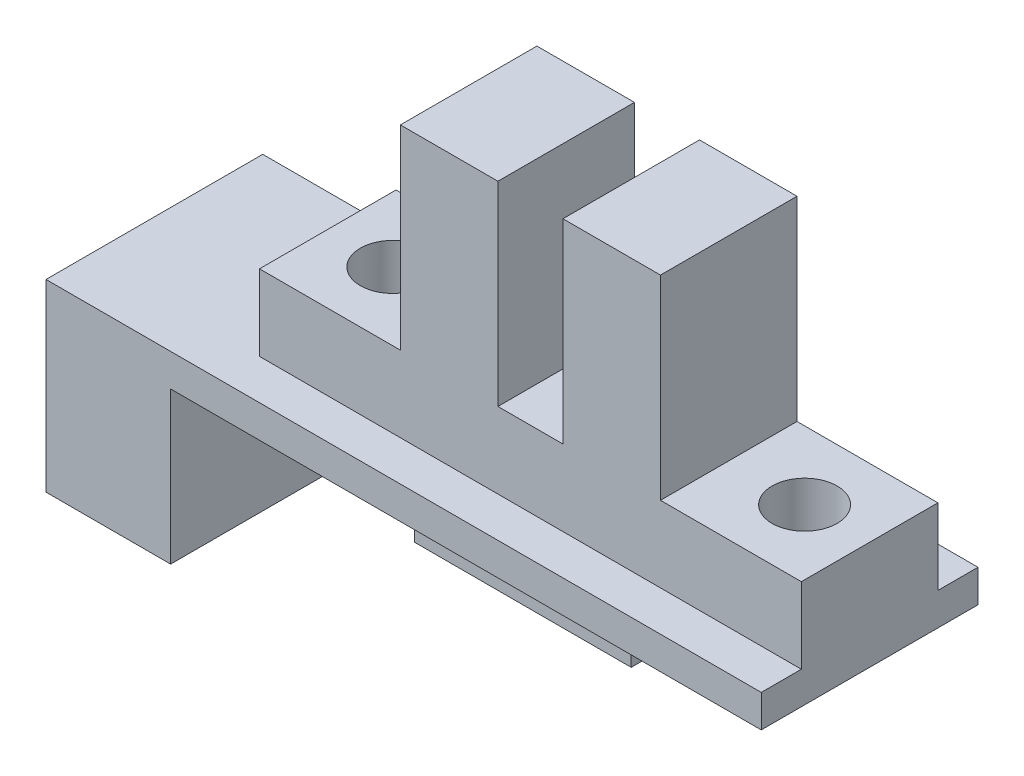
ISO-10303-21;
HEADER;
FILE_DESCRIPTION(('STEP AP214'),'2;1');
FILE_NAME('part.step','',(''),(''),'','','');
FILE_SCHEMA(('AUTOMOTIVE_DESIGN { 1 0 10303 214 1 1 1 1 }'));
ENDSEC;
DATA;
#1=APPLICATION_CONTEXT('core data for automotive mechanical design processes');
#2=APPLICATION_PROTOCOL_DEFINITION('international standard','automotive_design',2000,#1);
#3=PRODUCT_CONTEXT('',#1,'mechanical');
#4=PRODUCT('Part','Part','',(#3));
#5=PRODUCT_RELATED_PRODUCT_CATEGORY('part','',(#4));
#6=PRODUCT_DEFINITION_FORMATION('','',#4);
#7=PRODUCT_DEFINITION_CONTEXT('part definition',#1,'design');
#8=PRODUCT_DEFINITION('design','',#6,#7);
#9=PRODUCT_DEFINITION_SHAPE('','',#8);
#10=(LENGTH_UNIT() NAMED_UNIT(*) SI_UNIT(.MILLI.,.METRE.));
#11=(NAMED_UNIT(*) PLANE_ANGLE_UNIT() SI_UNIT($,.RADIAN.));
#12=(NAMED_UNIT(*) SI_UNIT($,.STERADIAN.) SOLID_ANGLE_UNIT());
#13=UNCERTAINTY_MEASURE_WITH_UNIT(LENGTH_MEASURE(1.E-05),#10,'distance_accuracy_value','');
#14=(GEOMETRIC_REPRESENTATION_CONTEXT(3) GLOBAL_UNCERTAINTY_ASSIGNED_CONTEXT((#13)) GLOBAL_UNIT_ASSIGNED_CONTEXT((#10,
#11,#12)) REPRESENTATION_CONTEXT('',''));
#15=CARTESIAN_POINT('',(0.,0.,0.));
#16=DIRECTION('',(0.,0.,1.));
#17=DIRECTION('',(1.,0.,0.));
#18=AXIS2_PLACEMENT_3D('',#15,#16,#17);
#19=CARTESIAN_POINT('',(0.,0.,0.));
#20=DIRECTION('',(0.,-1.,0.));
#21=DIRECTION('',(0.,0.,-1.));
#22=AXIS2_PLACEMENT_3D('',#19,#20,#21);
#23=PLANE('',#22);
#24=CARTESIAN_POINT('',(13.5,0.,0.));
#25=DIRECTION('',(0.,-1.,0.));
#26=DIRECTION('',(0.,0.,-1.));
#27=AXIS2_PLACEMENT_3D('',#24,#25,#26);
#28=CIRCLE('',#27,1.5);
#29=CARTESIAN_POINT('',(13.5,0.,-1.5));
#30=VERTEX_POINT('',#29);
#31=EDGE_CURVE('E39',#30,#30,#28,.T.);
#32=ORIENTED_EDGE('',*,*,#31,.F.);
#33=EDGE_LOOP('',(#32));
#34=FACE_BOUND('',#33,.T.);
#35=CARTESIAN_POINT('',(-5.49999999999999,0.,0.));
#36=DIRECTION('',(0.,-1.,0.));
#37=DIRECTION('',(0.,0.,-1.));
#38=AXIS2_PLACEMENT_3D('',#35,#36,#37);
#39=CIRCLE('',#38,1.5);
#40=CARTESIAN_POINT('',(-5.49999999999999,0.,-1.5));
#41=VERTEX_POINT('',#40);
#42=EDGE_CURVE('E306',#41,#41,#39,.T.);
#43=ORIENTED_EDGE('',*,*,#42,.F.);
#44=EDGE_LOOP('',(#43));
#45=FACE_BOUND('',#44,.T.);
#46=DIRECTION('',(0.,0.,1.));
#47=VECTOR('',#46,1.);
#48=CARTESIAN_POINT('',(-10.75,0.,5.));
#49=LINE('',#48,#47);
#50=CARTESIAN_POINT('',(-10.75,0.,-5.));
#51=VERTEX_POINT('',#50);
#52=CARTESIAN_POINT('',(-10.75,0.,5.));
#53=VERTEX_POINT('',#52);
#54=EDGE_CURVE('E311',#51,#53,#49,.T.);
#55=ORIENTED_EDGE('',*,*,#54,.F.);
#56=DIRECTION('',(-1.,0.,0.));
#57=VECTOR('',#56,1.);
#58=CARTESIAN_POINT('',(16.5,0.,-5.));
#59=LINE('',#58,#57);
#60=CARTESIAN_POINT('',(16.5,0.,-5.));
#61=VERTEX_POINT('',#60);
#62=EDGE_CURVE('E331',#61,#51,#59,.T.);
#63=ORIENTED_EDGE('',*,*,#62,.F.);
#64=DIRECTION('',(0.,0.,-1.));
#65=VECTOR('',#64,1.);
#66=CARTESIAN_POINT('',(16.5,0.,-5.));
#67=LINE('',#66,#65);
#68=CARTESIAN_POINT('',(16.5,0.,5.));
#69=VERTEX_POINT('',#68);
#70=EDGE_CURVE('E340',#69,#61,#67,.T.);
#71=ORIENTED_EDGE('',*,*,#70,.F.);
#72=DIRECTION('',(1.,0.,0.));
#73=VECTOR('',#72,1.);
#74=CARTESIAN_POINT('',(16.5,0.,5.));
#75=LINE('',#74,#73);
#76=EDGE_CURVE('E326',#53,#69,#75,.T.);
#77=ORIENTED_EDGE('',*,*,#76,.F.);
#78=EDGE_LOOP('',(#55,#63,#71,#77));
#79=FACE_BOUND('',#78,.T.);
#80=DIRECTION('',(1.,0.,0.));
#81=VECTOR('',#80,1.);
#82=CARTESIAN_POINT('',(9.00000000000001,0.,-3.5));
#83=LINE('',#82,#81);
#84=CARTESIAN_POINT('',(-0.999999999999986,0.,-3.5));
#85=VERTEX_POINT('',#84);
#86=CARTESIAN_POINT('',(9.00000000000001,0.,-3.5));
#87=VERTEX_POINT('',#86);
#88=EDGE_CURVE('E366',#85,#87,#83,.T.);
#89=ORIENTED_EDGE('',*,*,#88,.F.);
#90=DIRECTION('',(0.,0.,-1.));
#91=VECTOR('',#90,1.);
#92=CARTESIAN_POINT('',(-0.999999999999987,0.,3.5));
#93=LINE('',#92,#91);
#94=CARTESIAN_POINT('',(-0.999999999999987,0.,3.5));
#95=VERTEX_POINT('',#94);
#96=EDGE_CURVE('E208',#95,#85,#93,.T.);
#97=ORIENTED_EDGE('',*,*,#96,.F.);
#98=DIRECTION('',(-1.,0.,0.));
#99=VECTOR('',#98,1.);
#100=CARTESIAN_POINT('',(9.00000000000001,0.,3.5));
#101=LINE('',#100,#99);
#102=CARTESIAN_POINT('',(9.00000000000001,0.,3.5));
#103=VERTEX_POINT('',#102);
#104=EDGE_CURVE('E204',#103,#95,#101,.T.);
#105=ORIENTED_EDGE('',*,*,#104,.F.);
#106=DIRECTION('',(0.,0.,1.));
#107=VECTOR('',#106,1.);
#108=CARTESIAN_POINT('',(9.00000000000001,0.,3.5));
#109=LINE('',#108,#107);
#110=EDGE_CURVE('E368',#87,#103,#109,.T.);
#111=ORIENTED_EDGE('',*,*,#110,.F.);
#112=EDGE_LOOP('',(#89,#97,#105,#111));
#113=FACE_BOUND('',#112,.T.);
#114=ADVANCED_FACE('F35',(#34,#45,#79,#113),#23,.T.);
#115=CARTESIAN_POINT('',(0.,5.,0.));
#116=DIRECTION('',(0.,-1.,0.));
#117=DIRECTION('',(0.,0.,-1.));
#118=AXIS2_PLACEMENT_3D('',#115,#116,#117);
#119=PLANE('',#118);
#120=CARTESIAN_POINT('',(13.5,5.,0.));
#121=DIRECTION('',(0.,1.,0.));
#122=DIRECTION('',(0.,0.,1.));
#123=AXIS2_PLACEMENT_3D('',#120,#121,#122);
#124=CIRCLE('',#123,1.5);
#125=CARTESIAN_POINT('',(13.5,5.,1.5));
#126=VERTEX_POINT('',#125);
#127=EDGE_CURVE('E269',#126,#126,#124,.T.);
#128=ORIENTED_EDGE('',*,*,#127,.F.);
#129=EDGE_LOOP('',(#128));
#130=FACE_BOUND('',#129,.T.);
#131=DIRECTION('',(0.,0.,-1.));
#132=VECTOR('',#131,1.);
#133=CARTESIAN_POINT('',(10.,5.,-3.15));
#134=LINE('',#133,#132);
#135=CARTESIAN_POINT('',(10.,5.,3.15));
#136=VERTEX_POINT('',#135);
#137=CARTESIAN_POINT('',(10.,5.,-3.15));
#138=VERTEX_POINT('',#137);
#139=EDGE_CURVE('E60',#136,#138,#134,.T.);
#140=ORIENTED_EDGE('',*,*,#139,.F.);
#141=DIRECTION('',(1.,0.,0.));
#142=VECTOR('',#141,1.);
#143=CARTESIAN_POINT('',(16.5,5.,3.15));
#144=LINE('',#143,#142);
#145=CARTESIAN_POINT('',(16.5,5.,3.15));
#146=VERTEX_POINT('',#145);
#147=EDGE_CURVE('E276',#136,#146,#144,.T.);
#148=ORIENTED_EDGE('',*,*,#147,.T.);
#149=DIRECTION('',(0.,0.,-1.));
#150=VECTOR('',#149,1.);
#151=CARTESIAN_POINT('',(16.5,5.,-3.15));
#152=LINE('',#151,#150);
#153=CARTESIAN_POINT('',(16.5,5.,-3.15));
#154=VERTEX_POINT('',#153);
#155=EDGE_CURVE('E280',#146,#154,#152,.T.);
#156=ORIENTED_EDGE('',*,*,#155,.T.);
#157=DIRECTION('',(-1.,0.,0.));
#158=VECTOR('',#157,1.);
#159=CARTESIAN_POINT('',(16.5,5.,-3.15));
#160=LINE('',#159,#158);
#161=EDGE_CURVE('E284',#154,#138,#160,.T.);
#162=ORIENTED_EDGE('',*,*,#161,.T.);
#163=EDGE_LOOP('',(#140,#148,#156,#162));
#164=FACE_BOUND('',#163,.T.);
#165=ADVANCED_FACE('F360',(#130,#164),#119,.F.);
#166=DIRECTION('',(0.,0.,1.));
#167=VECTOR('',#166,1.);
#168=CARTESIAN_POINT('',(5.50000000000001,5.,-3.15));
#169=LINE('',#168,#167);
#170=CARTESIAN_POINT('',(5.50000000000001,5.,-3.15));
#171=VERTEX_POINT('',#170);
#172=CARTESIAN_POINT('',(5.50000000000001,5.,3.15));
#173=VERTEX_POINT('',#172);
#174=EDGE_CURVE('E211',#171,#173,#169,.T.);
#175=ORIENTED_EDGE('',*,*,#174,.F.);
#176=CARTESIAN_POINT('',(2.50000000000001,5.,-3.15));
#177=VERTEX_POINT('',#176);
#178=EDGE_CURVE('E287',#171,#177,#160,.T.);
#179=ORIENTED_EDGE('',*,*,#178,.T.);
#180=DIRECTION('',(0.,0.,-1.));
#181=VECTOR('',#180,1.);
#182=CARTESIAN_POINT('',(2.50000000000001,5.,-3.15));
#183=LINE('',#182,#181);
#184=CARTESIAN_POINT('',(2.50000000000001,5.,3.15));
#185=VERTEX_POINT('',#184);
#186=EDGE_CURVE('E239',#185,#177,#183,.T.);
#187=ORIENTED_EDGE('',*,*,#186,.F.);
#188=EDGE_CURVE('E281',#185,#173,#144,.T.);
#189=ORIENTED_EDGE('',*,*,#188,.T.);
#190=EDGE_LOOP('',(#175,#179,#187,#189));
#191=FACE_BOUND('',#190,.T.);
#192=ADVANCED_FACE('F422',(#191),#119,.F.);
#193=CARTESIAN_POINT('',(-5.49999999999999,5.,0.));
#194=DIRECTION('',(0.,1.,0.));
#195=DIRECTION('',(0.,0.,1.));
#196=AXIS2_PLACEMENT_3D('',#193,#194,#195);
#197=CIRCLE('',#196,1.5);
#198=CARTESIAN_POINT('',(-5.49999999999999,5.,1.5));
#199=VERTEX_POINT('',#198);
#200=EDGE_CURVE('E266',#199,#199,#197,.T.);
#201=ORIENTED_EDGE('',*,*,#200,.F.);
#202=EDGE_LOOP('',(#201));
#203=FACE_BOUND('',#202,.T.);
#204=DIRECTION('',(0.,0.,1.));
#205=VECTOR('',#204,1.);
#206=CARTESIAN_POINT('',(-1.99999999999999,5.,-3.15));
#207=LINE('',#206,#205);
#208=CARTESIAN_POINT('',(-1.99999999999999,5.,-3.15));
#209=VERTEX_POINT('',#208);
#210=CARTESIAN_POINT('',(-1.99999999999999,5.,3.15));
#211=VERTEX_POINT('',#210);
#212=EDGE_CURVE('E244',#209,#211,#207,.T.);
#213=ORIENTED_EDGE('',*,*,#212,.F.);
#214=CARTESIAN_POINT('',(-8.49999999999999,5.,-3.15));
#215=VERTEX_POINT('',#214);
#216=EDGE_CURVE('E283',#209,#215,#160,.T.);
#217=ORIENTED_EDGE('',*,*,#216,.T.);
#218=DIRECTION('',(0.,0.,1.));
#219=VECTOR('',#218,1.);
#220=CARTESIAN_POINT('',(-8.49999999999999,5.,-3.15));
#221=LINE('',#220,#219);
#222=CARTESIAN_POINT('',(-8.49999999999999,5.,3.15));
#223=VERTEX_POINT('',#222);
#224=EDGE_CURVE('E273',#215,#223,#221,.T.);
#225=ORIENTED_EDGE('',*,*,#224,.T.);
#226=EDGE_CURVE('E278',#223,#211,#144,.T.);
#227=ORIENTED_EDGE('',*,*,#226,.T.);
#228=EDGE_LOOP('',(#213,#217,#225,#227));
#229=FACE_BOUND('',#228,.T.);
#230=ADVANCED_FACE('F418',(#203,#229),#119,.F.);
#231=CARTESIAN_POINT('',(0.,1.5,0.));
#232=DIRECTION('',(0.,-1.,0.));
#233=DIRECTION('',(0.,0.,-1.));
#234=AXIS2_PLACEMENT_3D('',#231,#232,#233);
#235=PLANE('',#234);
#236=DIRECTION('',(-1.,0.,0.));
#237=VECTOR('',#236,1.);
#238=CARTESIAN_POINT('',(16.5,1.5,-3.15));
#239=LINE('',#238,#237);
#240=CARTESIAN_POINT('',(16.5,1.5,-3.15));
#241=VERTEX_POINT('',#240);
#242=CARTESIAN_POINT('',(-8.49999999999999,1.5,-3.15));
#243=VERTEX_POINT('',#242);
#244=EDGE_CURVE('E277',#241,#243,#239,.T.);
#245=ORIENTED_EDGE('',*,*,#244,.F.);
#246=DIRECTION('',(0.,0.,-1.));
#247=VECTOR('',#246,1.);
#248=CARTESIAN_POINT('',(16.5,1.5,-5.));
#249=LINE('',#248,#247);
#250=CARTESIAN_POINT('',(16.5,1.5,-5.));
#251=VERTEX_POINT('',#250);
#252=EDGE_CURVE('E333',#241,#251,#249,.T.);
#253=ORIENTED_EDGE('',*,*,#252,.T.);
#254=DIRECTION('',(-1.,0.,0.));
#255=VECTOR('',#254,1.);
#256=CARTESIAN_POINT('',(16.5,1.5,-5.));
#257=LINE('',#256,#255);
#258=CARTESIAN_POINT('',(-16.5,1.5,-5.));
#259=VERTEX_POINT('',#258);
#260=EDGE_CURVE('E336',#251,#259,#257,.T.);
#261=ORIENTED_EDGE('',*,*,#260,.T.);
#262=DIRECTION('',(0.,0.,1.));
#263=VECTOR('',#262,1.);
#264=CARTESIAN_POINT('',(-16.5,1.5,-5.));
#265=LINE('',#264,#263);
#266=CARTESIAN_POINT('',(-16.5,1.5,5.));
#267=VERTEX_POINT('',#266);
#268=EDGE_CURVE('E327',#259,#267,#265,.T.);
#269=ORIENTED_EDGE('',*,*,#268,.T.);
#270=DIRECTION('',(1.,0.,0.));
#271=VECTOR('',#270,1.);
#272=CARTESIAN_POINT('',(16.5,1.5,5.));
#273=LINE('',#272,#271);
#274=CARTESIAN_POINT('',(16.5,1.5,5.));
#275=VERTEX_POINT('',#274);
#276=EDGE_CURVE('E330',#267,#275,#273,.T.);
#277=ORIENTED_EDGE('',*,*,#276,.T.);
#278=CARTESIAN_POINT('',(16.5,1.5,3.15));
#279=VERTEX_POINT('',#278);
#280=EDGE_CURVE('E334',#275,#279,#249,.T.);
#281=ORIENTED_EDGE('',*,*,#280,.T.);
#282=DIRECTION('',(1.,0.,0.));
#283=VECTOR('',#282,1.);
#284=CARTESIAN_POINT('',(16.5,1.5,3.15));
#285=LINE('',#284,#283);
#286=CARTESIAN_POINT('',(-8.49999999999999,1.5,3.15));
#287=VERTEX_POINT('',#286);
#288=EDGE_CURVE('E290',#287,#279,#285,.T.);
#289=ORIENTED_EDGE('',*,*,#288,.F.);
#290=DIRECTION('',(0.,0.,1.));
#291=VECTOR('',#290,1.);
#292=CARTESIAN_POINT('',(-8.49999999999999,1.5,-3.15));
#293=LINE('',#292,#291);
#294=EDGE_CURVE('E272',#243,#287,#293,.T.);
#295=ORIENTED_EDGE('',*,*,#294,.F.);
#296=EDGE_LOOP('',(#245,#253,#261,#269,#277,#281,#289,#295));
#297=FACE_BOUND('',#296,.T.);
#298=ADVANCED_FACE('F421',(#297),#235,.F.);
#299=CARTESIAN_POINT('',(-16.5,1.5,-5.));
#300=DIRECTION('',(1.,0.,0.));
#301=DIRECTION('',(0.,0.,-1.));
#302=AXIS2_PLACEMENT_3D('',#299,#300,#301);
#303=PLANE('',#302);
#304=DIRECTION('',(0.,-1.,0.));
#305=VECTOR('',#304,1.);
#306=CARTESIAN_POINT('',(-16.5,1.5,-5.));
#307=LINE('',#306,#305);
#308=CARTESIAN_POINT('',(-16.5,-7.,-5.));
#309=VERTEX_POINT('',#308);
#310=EDGE_CURVE('E338',#259,#309,#307,.T.);
#311=ORIENTED_EDGE('',*,*,#310,.T.);
#312=DIRECTION('',(0.,0.,-1.));
#313=VECTOR('',#312,1.);
#314=CARTESIAN_POINT('',(-16.5,-7.,5.));
#315=LINE('',#314,#313);
#316=CARTESIAN_POINT('',(-16.5,-7.,5.));
#317=VERTEX_POINT('',#316);
#318=EDGE_CURVE('E307',#317,#309,#315,.T.);
#319=ORIENTED_EDGE('',*,*,#318,.F.);
#320=DIRECTION('',(0.,-1.,0.));
#321=VECTOR('',#320,1.);
#322=CARTESIAN_POINT('',(-16.5,1.5,5.));
#323=LINE('',#322,#321);
#324=EDGE_CURVE('E11',#267,#317,#323,.T.);
#325=ORIENTED_EDGE('',*,*,#324,.F.);
#326=ORIENTED_EDGE('',*,*,#268,.F.);
#327=EDGE_LOOP('',(#311,#319,#325,#326));
#328=FACE_BOUND('',#327,.T.);
#329=ADVANCED_FACE('F37',(#328),#303,.F.);
#330=CARTESIAN_POINT('',(16.5,1.5,5.));
#331=DIRECTION('',(0.,0.,-1.));
#332=DIRECTION('',(-1.,0.,0.));
#333=AXIS2_PLACEMENT_3D('',#330,#331,#332);
#334=PLANE('',#333);
#335=ORIENTED_EDGE('',*,*,#324,.T.);
#336=DIRECTION('',(-1.,0.,0.));
#337=VECTOR('',#336,1.);
#338=CARTESIAN_POINT('',(-16.5,-7.,5.));
#339=LINE('',#338,#337);
#340=CARTESIAN_POINT('',(-10.75,-7.,5.));
#341=VERTEX_POINT('',#340);
#342=EDGE_CURVE('E315',#341,#317,#339,.T.);
#343=ORIENTED_EDGE('',*,*,#342,.F.);
#344=DIRECTION('',(0.,1.,0.));
#345=VECTOR('',#344,1.);
#346=CARTESIAN_POINT('',(-10.75,-7.,5.));
#347=LINE('',#346,#345);
#348=EDGE_CURVE('E318',#341,#53,#347,.T.);
#349=ORIENTED_EDGE('',*,*,#348,.T.);
#350=ORIENTED_EDGE('',*,*,#76,.T.);
#351=DIRECTION('',(0.,-1.,0.));
#352=VECTOR('',#351,1.);
#353=CARTESIAN_POINT('',(16.5,1.5,5.));
#354=LINE('',#353,#352);
#355=EDGE_CURVE('E44',#275,#69,#354,.T.);
#356=ORIENTED_EDGE('',*,*,#355,.F.);
#357=ORIENTED_EDGE('',*,*,#276,.F.);
#358=EDGE_LOOP('',(#335,#343,#349,#350,#356,#357));
#359=FACE_BOUND('',#358,.T.);
#360=ADVANCED_FACE('F457',(#359),#334,.F.);
#361=CARTESIAN_POINT('',(16.5,1.5,-5.));
#362=DIRECTION('',(-1.,0.,0.));
#363=DIRECTION('',(0.,0.,1.));
#364=AXIS2_PLACEMENT_3D('',#361,#362,#363);
#365=PLANE('',#364);
#366=ORIENTED_EDGE('',*,*,#70,.T.);
#367=DIRECTION('',(0.,-1.,0.));
#368=VECTOR('',#367,1.);
#369=CARTESIAN_POINT('',(16.5,1.5,-5.));
#370=LINE('',#369,#368);
#371=EDGE_CURVE('E345',#251,#61,#370,.T.);
#372=ORIENTED_EDGE('',*,*,#371,.F.);
#373=ORIENTED_EDGE('',*,*,#252,.F.);
#374=DIRECTION('',(0.,-1.,0.));
#375=VECTOR('',#374,1.);
#376=CARTESIAN_POINT('',(16.5,5.,-3.15));
#377=LINE('',#376,#375);
#378=EDGE_CURVE('E297',#154,#241,#377,.T.);
#379=ORIENTED_EDGE('',*,*,#378,.F.);
#380=ORIENTED_EDGE('',*,*,#155,.F.);
#381=DIRECTION('',(0.,-1.,0.));
#382=VECTOR('',#381,1.);
#383=CARTESIAN_POINT('',(16.5,5.,3.15));
#384=LINE('',#383,#382);
#385=EDGE_CURVE('E300',#146,#279,#384,.T.);
#386=ORIENTED_EDGE('',*,*,#385,.T.);
#387=ORIENTED_EDGE('',*,*,#280,.F.);
#388=ORIENTED_EDGE('',*,*,#355,.T.);
#389=EDGE_LOOP('',(#366,#372,#373,#379,#380,#386,#387,#388));
#390=FACE_BOUND('',#389,.T.);
#391=ADVANCED_FACE('F454',(#390),#365,.F.);
#392=CARTESIAN_POINT('',(16.5,1.5,-5.));
#393=DIRECTION('',(0.,0.,1.));
#394=DIRECTION('',(1.,0.,0.));
#395=AXIS2_PLACEMENT_3D('',#392,#393,#394);
#396=PLANE('',#395);
#397=ORIENTED_EDGE('',*,*,#62,.T.);
#398=DIRECTION('',(0.,1.,0.));
#399=VECTOR('',#398,1.);
#400=CARTESIAN_POINT('',(-10.75,-7.,-5.));
#401=LINE('',#400,#399);
#402=CARTESIAN_POINT('',(-10.75,-7.,-5.));
#403=VERTEX_POINT('',#402);
#404=EDGE_CURVE('E323',#403,#51,#401,.T.);
#405=ORIENTED_EDGE('',*,*,#404,.F.);
#406=DIRECTION('',(1.,0.,0.));
#407=VECTOR('',#406,1.);
#408=CARTESIAN_POINT('',(-16.5,-7.,-5.));
#409=LINE('',#408,#407);
#410=EDGE_CURVE('E310',#309,#403,#409,.T.);
#411=ORIENTED_EDGE('',*,*,#410,.F.);
#412=ORIENTED_EDGE('',*,*,#310,.F.);
#413=ORIENTED_EDGE('',*,*,#260,.F.);
#414=ORIENTED_EDGE('',*,*,#371,.T.);
#415=EDGE_LOOP('',(#397,#405,#411,#412,#413,#414));
#416=FACE_BOUND('',#415,.T.);
#417=ADVANCED_FACE('F447',(#416),#396,.F.);
#418=CARTESIAN_POINT('',(-10.75,-7.,5.));
#419=DIRECTION('',(-1.,0.,0.));
#420=DIRECTION('',(0.,0.,1.));
#421=AXIS2_PLACEMENT_3D('',#418,#419,#420);
#422=PLANE('',#421);
#423=ORIENTED_EDGE('',*,*,#54,.T.);
#424=ORIENTED_EDGE('',*,*,#348,.F.);
#425=DIRECTION('',(0.,0.,1.));
#426=VECTOR('',#425,1.);
#427=CARTESIAN_POINT('',(-10.75,-7.,5.));
#428=LINE('',#427,#426);
#429=EDGE_CURVE('E313',#403,#341,#428,.T.);
#430=ORIENTED_EDGE('',*,*,#429,.F.);
#431=ORIENTED_EDGE('',*,*,#404,.T.);
#432=EDGE_LOOP('',(#423,#424,#430,#431));
#433=FACE_BOUND('',#432,.T.);
#434=ADVANCED_FACE('F443',(#433),#422,.F.);
#435=CARTESIAN_POINT('',(0.,-7.,0.));
#436=DIRECTION('',(0.,-1.,0.));
#437=DIRECTION('',(0.,0.,-1.));
#438=AXIS2_PLACEMENT_3D('',#435,#436,#437);
#439=PLANE('',#438);
#440=ORIENTED_EDGE('',*,*,#318,.T.);
#441=ORIENTED_EDGE('',*,*,#410,.T.);
#442=ORIENTED_EDGE('',*,*,#429,.T.);
#443=ORIENTED_EDGE('',*,*,#342,.T.);
#444=EDGE_LOOP('',(#440,#441,#442,#443));
#445=FACE_BOUND('',#444,.T.);
#446=ADVANCED_FACE('F440',(#445),#439,.T.);
#447=CARTESIAN_POINT('',(-5.49999999999999,-7.,0.));
#448=DIRECTION('',(0.,1.,0.));
#449=DIRECTION('',(0.,0.,1.));
#450=AXIS2_PLACEMENT_3D('',#447,#448,#449);
#451=CYLINDRICAL_SURFACE('',#450,1.5);
#452=ORIENTED_EDGE('',*,*,#42,.T.);
#453=EDGE_LOOP('',(#452));
#454=FACE_BOUND('',#453,.T.);
#455=ORIENTED_EDGE('',*,*,#200,.T.);
#456=EDGE_LOOP('',(#455));
#457=FACE_BOUND('',#456,.T.);
#458=ADVANCED_FACE('F437',(#454,#457),#451,.F.);
#459=CARTESIAN_POINT('',(13.5,-7.,0.));
#460=DIRECTION('',(0.,1.,0.));
#461=DIRECTION('',(0.,0.,1.));
#462=AXIS2_PLACEMENT_3D('',#459,#460,#461);
#463=CYLINDRICAL_SURFACE('',#462,1.5);
#464=ORIENTED_EDGE('',*,*,#31,.T.);
#465=EDGE_LOOP('',(#464));
#466=FACE_BOUND('',#465,.T.);
#467=ORIENTED_EDGE('',*,*,#127,.T.);
#468=EDGE_LOOP('',(#467));
#469=FACE_BOUND('',#468,.T.);
#470=ADVANCED_FACE('F355',(#466,#469),#463,.F.);
#471=CARTESIAN_POINT('',(-8.49999999999999,5.,-3.15));
#472=DIRECTION('',(1.,0.,0.));
#473=DIRECTION('',(0.,0.,-1.));
#474=AXIS2_PLACEMENT_3D('',#471,#472,#473);
#475=PLANE('',#474);
#476=ORIENTED_EDGE('',*,*,#294,.T.);
#477=DIRECTION('',(0.,-1.,0.));
#478=VECTOR('',#477,1.);
#479=CARTESIAN_POINT('',(-8.49999999999999,5.,3.15));
#480=LINE('',#479,#478);
#481=EDGE_CURVE('E303',#223,#287,#480,.T.);
#482=ORIENTED_EDGE('',*,*,#481,.F.);
#483=ORIENTED_EDGE('',*,*,#224,.F.);
#484=DIRECTION('',(0.,-1.,0.));
#485=VECTOR('',#484,1.);
#486=CARTESIAN_POINT('',(-8.49999999999999,5.,-3.15));
#487=LINE('',#486,#485);
#488=EDGE_CURVE('E286',#215,#243,#487,.T.);
#489=ORIENTED_EDGE('',*,*,#488,.T.);
#490=EDGE_LOOP('',(#476,#482,#483,#489));
#491=FACE_BOUND('',#490,.T.);
#492=ADVANCED_FACE('F430',(#491),#475,.F.);
#493=CARTESIAN_POINT('',(16.5,5.,3.15));
#494=DIRECTION('',(0.,0.,-1.));
#495=DIRECTION('',(-1.,0.,0.));
#496=AXIS2_PLACEMENT_3D('',#493,#494,#495);
#497=PLANE('',#496);
#498=ORIENTED_EDGE('',*,*,#288,.T.);
#499=ORIENTED_EDGE('',*,*,#385,.F.);
#500=ORIENTED_EDGE('',*,*,#147,.F.);
#501=DIRECTION('',(0.,-1.,0.));
#502=VECTOR('',#501,1.);
#503=CARTESIAN_POINT('',(10.,14.,3.15));
#504=LINE('',#503,#502);
#505=CARTESIAN_POINT('',(10.,14.,3.15));
#506=VERTEX_POINT('',#505);
#507=EDGE_CURVE('E224',#506,#136,#504,.T.);
#508=ORIENTED_EDGE('',*,*,#507,.F.);
#509=DIRECTION('',(1.,0.,0.));
#510=VECTOR('',#509,1.);
#511=CARTESIAN_POINT('',(10.,14.,3.15));
#512=LINE('',#511,#510);
#513=CARTESIAN_POINT('',(5.50000000000001,14.,3.15));
#514=VERTEX_POINT('',#513);
#515=EDGE_CURVE('E223',#514,#506,#512,.T.);
#516=ORIENTED_EDGE('',*,*,#515,.F.);
#517=DIRECTION('',(0.,-1.,0.));
#518=VECTOR('',#517,1.);
#519=CARTESIAN_POINT('',(5.50000000000001,14.,3.15));
#520=LINE('',#519,#518);
#521=EDGE_CURVE('E230',#514,#173,#520,.T.);
#522=ORIENTED_EDGE('',*,*,#521,.T.);
#523=ORIENTED_EDGE('',*,*,#188,.F.);
#524=DIRECTION('',(0.,-1.,0.));
#525=VECTOR('',#524,1.);
#526=CARTESIAN_POINT('',(2.50000000000001,14.,3.15));
#527=LINE('',#526,#525);
#528=CARTESIAN_POINT('',(2.50000000000001,14.,3.15));
#529=VERTEX_POINT('',#528);
#530=EDGE_CURVE('E263',#529,#185,#527,.T.);
#531=ORIENTED_EDGE('',*,*,#530,.F.);
#532=DIRECTION('',(1.,0.,0.));
#533=VECTOR('',#532,1.);
#534=CARTESIAN_POINT('',(2.50000000000001,14.,3.15));
#535=LINE('',#534,#533);
#536=CARTESIAN_POINT('',(-1.99999999999999,14.,3.15));
#537=VERTEX_POINT('',#536);
#538=EDGE_CURVE('E240',#537,#529,#535,.T.);
#539=ORIENTED_EDGE('',*,*,#538,.F.);
#540=DIRECTION('',(0.,-1.,0.));
#541=VECTOR('',#540,1.);
#542=CARTESIAN_POINT('',(-1.99999999999999,14.,3.15));
#543=LINE('',#542,#541);
#544=EDGE_CURVE('E250',#537,#211,#543,.T.);
#545=ORIENTED_EDGE('',*,*,#544,.T.);
#546=ORIENTED_EDGE('',*,*,#226,.F.);
#547=ORIENTED_EDGE('',*,*,#481,.T.);
#548=EDGE_LOOP('',(#498,#499,#500,#508,#516,#522,#523,#531,#539,#545,#546,#547));
#549=FACE_BOUND('',#548,.T.);
#550=ADVANCED_FACE('F426',(#549),#497,.F.);
#551=CARTESIAN_POINT('',(16.5,5.,-3.15));
#552=DIRECTION('',(0.,0.,1.));
#553=DIRECTION('',(1.,0.,0.));
#554=AXIS2_PLACEMENT_3D('',#551,#552,#553);
#555=PLANE('',#554);
#556=ORIENTED_EDGE('',*,*,#244,.T.);
#557=ORIENTED_EDGE('',*,*,#488,.F.);
#558=ORIENTED_EDGE('',*,*,#216,.F.);
#559=DIRECTION('',(0.,-1.,0.));
#560=VECTOR('',#559,1.);
#561=CARTESIAN_POINT('',(-1.99999999999999,14.,-3.15));
#562=LINE('',#561,#560);
#563=CARTESIAN_POINT('',(-1.99999999999999,14.,-3.15));
#564=VERTEX_POINT('',#563);
#565=EDGE_CURVE('E257',#564,#209,#562,.T.);
#566=ORIENTED_EDGE('',*,*,#565,.F.);
#567=DIRECTION('',(-1.,0.,0.));
#568=VECTOR('',#567,1.);
#569=CARTESIAN_POINT('',(2.50000000000001,14.,-3.15));
#570=LINE('',#569,#568);
#571=CARTESIAN_POINT('',(2.50000000000001,14.,-3.15));
#572=VERTEX_POINT('',#571);
#573=EDGE_CURVE('E246',#572,#564,#570,.T.);
#574=ORIENTED_EDGE('',*,*,#573,.F.);
#575=DIRECTION('',(0.,-1.,0.));
#576=VECTOR('',#575,1.);
#577=CARTESIAN_POINT('',(2.50000000000001,14.,-3.15));
#578=LINE('',#577,#576);
#579=EDGE_CURVE('E260',#572,#177,#578,.T.);
#580=ORIENTED_EDGE('',*,*,#579,.T.);
#581=ORIENTED_EDGE('',*,*,#178,.F.);
#582=DIRECTION('',(0.,-1.,0.));
#583=VECTOR('',#582,1.);
#584=CARTESIAN_POINT('',(5.50000000000001,14.,-3.15));
#585=LINE('',#584,#583);
#586=CARTESIAN_POINT('',(5.50000000000001,14.,-3.15));
#587=VERTEX_POINT('',#586);
#588=EDGE_CURVE('E233',#587,#171,#585,.T.);
#589=ORIENTED_EDGE('',*,*,#588,.F.);
#590=DIRECTION('',(-1.,0.,0.));
#591=VECTOR('',#590,1.);
#592=CARTESIAN_POINT('',(10.,14.,-3.15));
#593=LINE('',#592,#591);
#594=CARTESIAN_POINT('',(10.,14.,-3.15));
#595=VERTEX_POINT('',#594);
#596=EDGE_CURVE('E219',#595,#587,#593,.T.);
#597=ORIENTED_EDGE('',*,*,#596,.F.);
#598=DIRECTION('',(0.,-1.,0.));
#599=VECTOR('',#598,1.);
#600=CARTESIAN_POINT('',(10.,14.,-3.15));
#601=LINE('',#600,#599);
#602=EDGE_CURVE('E236',#595,#138,#601,.T.);
#603=ORIENTED_EDGE('',*,*,#602,.T.);
#604=ORIENTED_EDGE('',*,*,#161,.F.);
#605=ORIENTED_EDGE('',*,*,#378,.T.);
#606=EDGE_LOOP('',(#556,#557,#558,#566,#574,#580,#581,#589,#597,#603,#604,#605));
#607=FACE_BOUND('',#606,.T.);
#608=ADVANCED_FACE('F416',(#607),#555,.F.);
#609=CARTESIAN_POINT('',(2.50000000000001,14.,-3.15));
#610=DIRECTION('',(-1.,0.,0.));
#611=DIRECTION('',(0.,0.,1.));
#612=AXIS2_PLACEMENT_3D('',#609,#610,#611);
#613=PLANE('',#612);
#614=ORIENTED_EDGE('',*,*,#186,.T.);
#615=ORIENTED_EDGE('',*,*,#579,.F.);
#616=DIRECTION('',(0.,0.,-1.));
#617=VECTOR('',#616,1.);
#618=CARTESIAN_POINT('',(2.50000000000001,14.,-3.15));
#619=LINE('',#618,#617);
#620=EDGE_CURVE('E243',#529,#572,#619,.T.);
#621=ORIENTED_EDGE('',*,*,#620,.F.);
#622=ORIENTED_EDGE('',*,*,#530,.T.);
#623=EDGE_LOOP('',(#614,#615,#621,#622));
#624=FACE_BOUND('',#623,.T.);
#625=ADVANCED_FACE('F412',(#624),#613,.F.);
#626=CARTESIAN_POINT('',(-1.99999999999999,14.,-3.15));
#627=DIRECTION('',(1.,0.,0.));
#628=DIRECTION('',(0.,0.,-1.));
#629=AXIS2_PLACEMENT_3D('',#626,#627,#628);
#630=PLANE('',#629);
#631=ORIENTED_EDGE('',*,*,#212,.T.);
#632=ORIENTED_EDGE('',*,*,#544,.F.);
#633=DIRECTION('',(0.,0.,1.));
#634=VECTOR('',#633,1.);
#635=CARTESIAN_POINT('',(-1.99999999999999,14.,-3.15));
#636=LINE('',#635,#634);
#637=EDGE_CURVE('E248',#564,#537,#636,.T.);
#638=ORIENTED_EDGE('',*,*,#637,.F.);
#639=ORIENTED_EDGE('',*,*,#565,.T.);
#640=EDGE_LOOP('',(#631,#632,#638,#639));
#641=FACE_BOUND('',#640,.T.);
#642=ADVANCED_FACE('F408',(#641),#630,.F.);
#643=CARTESIAN_POINT('',(0.,14.,0.));
#644=DIRECTION('',(0.,1.,0.));
#645=DIRECTION('',(0.,0.,1.));
#646=AXIS2_PLACEMENT_3D('',#643,#644,#645);
#647=PLANE('',#646);
#648=ORIENTED_EDGE('',*,*,#538,.T.);
#649=ORIENTED_EDGE('',*,*,#620,.T.);
#650=ORIENTED_EDGE('',*,*,#573,.T.);
#651=ORIENTED_EDGE('',*,*,#637,.T.);
#652=EDGE_LOOP('',(#648,#649,#650,#651));
#653=FACE_BOUND('',#652,.T.);
#654=ADVANCED_FACE('F404',(#653),#647,.T.);
#655=CARTESIAN_POINT('',(10.,14.,-3.15));
#656=DIRECTION('',(-1.,0.,0.));
#657=DIRECTION('',(0.,0.,1.));
#658=AXIS2_PLACEMENT_3D('',#655,#656,#657);
#659=PLANE('',#658);
#660=ORIENTED_EDGE('',*,*,#139,.T.);
#661=ORIENTED_EDGE('',*,*,#602,.F.);
#662=DIRECTION('',(0.,0.,-1.));
#663=VECTOR('',#662,1.);
#664=CARTESIAN_POINT('',(10.,14.,-3.15));
#665=LINE('',#664,#663);
#666=EDGE_CURVE('E216',#506,#595,#665,.T.);
#667=ORIENTED_EDGE('',*,*,#666,.F.);
#668=ORIENTED_EDGE('',*,*,#507,.T.);
#669=EDGE_LOOP('',(#660,#661,#667,#668));
#670=FACE_BOUND('',#669,.T.);
#671=ADVANCED_FACE('F400',(#670),#659,.F.);
#672=CARTESIAN_POINT('',(5.50000000000001,14.,-3.15));
#673=DIRECTION('',(1.,0.,0.));
#674=DIRECTION('',(0.,0.,-1.));
#675=AXIS2_PLACEMENT_3D('',#672,#673,#674);
#676=PLANE('',#675);
#677=ORIENTED_EDGE('',*,*,#174,.T.);
#678=ORIENTED_EDGE('',*,*,#521,.F.);
#679=DIRECTION('',(0.,0.,1.));
#680=VECTOR('',#679,1.);
#681=CARTESIAN_POINT('',(5.50000000000001,14.,-3.15));
#682=LINE('',#681,#680);
#683=EDGE_CURVE('E221',#587,#514,#682,.T.);
#684=ORIENTED_EDGE('',*,*,#683,.F.);
#685=ORIENTED_EDGE('',*,*,#588,.T.);
#686=EDGE_LOOP('',(#677,#678,#684,#685));
#687=FACE_BOUND('',#686,.T.);
#688=ADVANCED_FACE('F396',(#687),#676,.F.);
#689=CARTESIAN_POINT('',(0.,14.,0.));
#690=DIRECTION('',(0.,-1.,0.));
#691=DIRECTION('',(0.,0.,-1.));
#692=AXIS2_PLACEMENT_3D('',#689,#690,#691);
#693=PLANE('',#692);
#694=ORIENTED_EDGE('',*,*,#666,.T.);
#695=ORIENTED_EDGE('',*,*,#596,.T.);
#696=ORIENTED_EDGE('',*,*,#683,.T.);
#697=ORIENTED_EDGE('',*,*,#515,.T.);
#698=EDGE_LOOP('',(#694,#695,#696,#697));
#699=FACE_BOUND('',#698,.T.);
#700=ADVANCED_FACE('F393',(#699),#693,.F.);
#701=CARTESIAN_POINT('',(-0.999999999999987,-2.,3.5));
#702=DIRECTION('',(1.,0.,0.));
#703=DIRECTION('',(0.,0.,-1.));
#704=AXIS2_PLACEMENT_3D('',#701,#702,#703);
#705=PLANE('',#704);
#706=ORIENTED_EDGE('',*,*,#96,.T.);
#707=DIRECTION('',(0.,1.,0.));
#708=VECTOR('',#707,1.);
#709=CARTESIAN_POINT('',(-0.999999999999986,-2.,-3.5));
#710=LINE('',#709,#708);
#711=CARTESIAN_POINT('',(-0.999999999999986,-2.,-3.5));
#712=VERTEX_POINT('',#711);
#713=EDGE_CURVE('E189',#712,#85,#710,.T.);
#714=ORIENTED_EDGE('',*,*,#713,.F.);
#715=DIRECTION('',(0.,0.,-1.));
#716=VECTOR('',#715,1.);
#717=CARTESIAN_POINT('',(-0.999999999999987,-2.,3.5));
#718=LINE('',#717,#716);
#719=CARTESIAN_POINT('',(-0.999999999999987,-2.,3.5));
#720=VERTEX_POINT('',#719);
#721=EDGE_CURVE('E196',#720,#712,#718,.T.);
#722=ORIENTED_EDGE('',*,*,#721,.F.);
#723=DIRECTION('',(0.,1.,0.));
#724=VECTOR('',#723,1.);
#725=CARTESIAN_POINT('',(-0.999999999999987,-2.,3.5));
#726=LINE('',#725,#724);
#727=EDGE_CURVE('E375',#720,#95,#726,.T.);
#728=ORIENTED_EDGE('',*,*,#727,.T.);
#729=EDGE_LOOP('',(#706,#714,#722,#728));
#730=FACE_BOUND('',#729,.T.);
#731=ADVANCED_FACE('F206',(#730),#705,.F.);
#732=CARTESIAN_POINT('',(9.00000000000001,-2.,-3.5));
#733=DIRECTION('',(0.,0.,1.));
#734=DIRECTION('',(1.,0.,0.));
#735=AXIS2_PLACEMENT_3D('',#732,#733,#734);
#736=PLANE('',#735);
#737=ORIENTED_EDGE('',*,*,#88,.T.);
#738=DIRECTION('',(0.,1.,0.));
#739=VECTOR('',#738,1.);
#740=CARTESIAN_POINT('',(9.00000000000001,-2.,-3.5));
#741=LINE('',#740,#739);
#742=CARTESIAN_POINT('',(9.00000000000001,-2.,-3.5));
#743=VERTEX_POINT('',#742);
#744=EDGE_CURVE('E192',#743,#87,#741,.T.);
#745=ORIENTED_EDGE('',*,*,#744,.F.);
#746=DIRECTION('',(1.,0.,0.));
#747=VECTOR('',#746,1.);
#748=CARTESIAN_POINT('',(9.00000000000001,-2.,-3.5));
#749=LINE('',#748,#747);
#750=EDGE_CURVE('E185',#712,#743,#749,.T.);
#751=ORIENTED_EDGE('',*,*,#750,.F.);
#752=ORIENTED_EDGE('',*,*,#713,.T.);
#753=EDGE_LOOP('',(#737,#745,#751,#752));
#754=FACE_BOUND('',#753,.T.);
#755=ADVANCED_FACE('F187',(#754),#736,.F.);
#756=CARTESIAN_POINT('',(9.00000000000001,-2.,3.5));
#757=DIRECTION('',(-1.,0.,0.));
#758=DIRECTION('',(0.,0.,1.));
#759=AXIS2_PLACEMENT_3D('',#756,#757,#758);
#760=PLANE('',#759);
#761=ORIENTED_EDGE('',*,*,#110,.T.);
#762=DIRECTION('',(0.,1.,0.));
#763=VECTOR('',#762,1.);
#764=CARTESIAN_POINT('',(9.00000000000001,-2.,3.5));
#765=LINE('',#764,#763);
#766=CARTESIAN_POINT('',(9.00000000000001,-2.,3.5));
#767=VERTEX_POINT('',#766);
#768=EDGE_CURVE('E52',#767,#103,#765,.T.);
#769=ORIENTED_EDGE('',*,*,#768,.F.);
#770=DIRECTION('',(0.,0.,1.));
#771=VECTOR('',#770,1.);
#772=CARTESIAN_POINT('',(9.00000000000001,-2.,3.5));
#773=LINE('',#772,#771);
#774=EDGE_CURVE('E195',#743,#767,#773,.T.);
#775=ORIENTED_EDGE('',*,*,#774,.F.);
#776=ORIENTED_EDGE('',*,*,#744,.T.);
#777=EDGE_LOOP('',(#761,#769,#775,#776));
#778=FACE_BOUND('',#777,.T.);
#779=ADVANCED_FACE('F378',(#778),#760,.F.);
#780=CARTESIAN_POINT('',(9.00000000000001,-2.,3.5));
#781=DIRECTION('',(0.,0.,-1.));
#782=DIRECTION('',(-1.,0.,0.));
#783=AXIS2_PLACEMENT_3D('',#780,#781,#782);
#784=PLANE('',#783);
#785=ORIENTED_EDGE('',*,*,#104,.T.);
#786=ORIENTED_EDGE('',*,*,#727,.F.);
#787=DIRECTION('',(-1.,0.,0.));
#788=VECTOR('',#787,1.);
#789=CARTESIAN_POINT('',(9.00000000000001,-2.,3.5));
#790=LINE('',#789,#788);
#791=EDGE_CURVE('E200',#767,#720,#790,.T.);
#792=ORIENTED_EDGE('',*,*,#791,.F.);
#793=ORIENTED_EDGE('',*,*,#768,.T.);
#794=EDGE_LOOP('',(#785,#786,#792,#793));
#795=FACE_BOUND('',#794,.T.);
#796=ADVANCED_FACE('F379',(#795),#784,.F.);
#797=CARTESIAN_POINT('',(0.,-2.,0.));
#798=DIRECTION('',(0.,1.,0.));
#799=DIRECTION('',(0.,0.,1.));
#800=AXIS2_PLACEMENT_3D('',#797,#798,#799);
#801=PLANE('',#800);
#802=ORIENTED_EDGE('',*,*,#721,.T.);
#803=ORIENTED_EDGE('',*,*,#750,.T.);
#804=ORIENTED_EDGE('',*,*,#774,.T.);
#805=ORIENTED_EDGE('',*,*,#791,.T.);
#806=EDGE_LOOP('',(#802,#803,#804,#805));
#807=FACE_BOUND('',#806,.T.);
#808=ADVANCED_FACE('F199',(#807),#801,.F.);
#809=CLOSED_SHELL('',(#114,#165,#192,#230,#298,#329,#360,#391,#417,#434,#446,#458,#470,#492,
#550,#608,#625,#642,#654,#671,#688,#700,#731,#755,#779,#796,#808));
#810=MANIFOLD_SOLID_BREP('B2',#809);
#811=ADVANCED_BREP_SHAPE_REPRESENTATION('',(#18,#810),#14);
#812=SHAPE_DEFINITION_REPRESENTATION(#9,#811);
ENDSEC;
END-ISO-10303-21;
